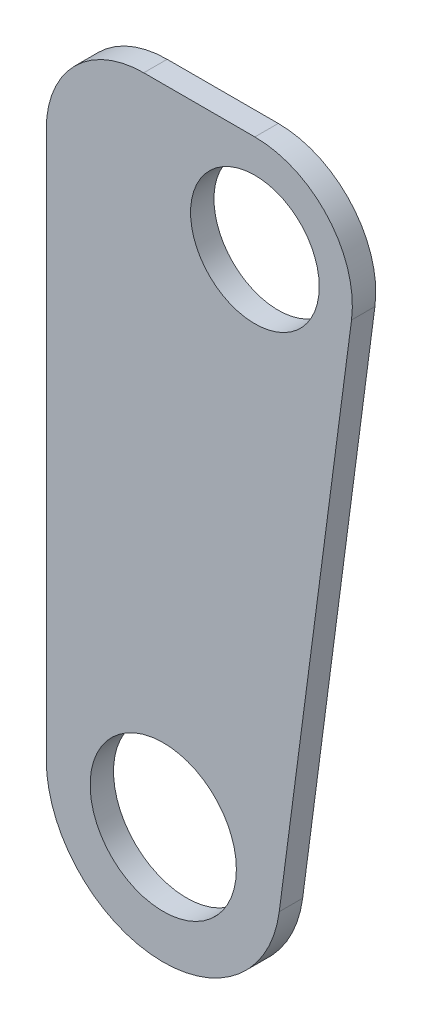
ISO-10303-21;
HEADER;
FILE_DESCRIPTION(('STEP AP214'),'2;1');
FILE_NAME('part.step','',(''),(''),'','','');
FILE_SCHEMA(('AUTOMOTIVE_DESIGN { 1 0 10303 214 1 1 1 1 }'));
ENDSEC;
DATA;
#1=APPLICATION_CONTEXT('core data for automotive mechanical design processes');
#2=APPLICATION_PROTOCOL_DEFINITION('international standard','automotive_design',2000,#1);
#3=PRODUCT_CONTEXT('',#1,'mechanical');
#4=PRODUCT('Part','Part','',(#3));
#5=PRODUCT_RELATED_PRODUCT_CATEGORY('part','',(#4));
#6=PRODUCT_DEFINITION_FORMATION('','',#4);
#7=PRODUCT_DEFINITION_CONTEXT('part definition',#1,'design');
#8=PRODUCT_DEFINITION('design','',#6,#7);
#9=PRODUCT_DEFINITION_SHAPE('','',#8);
#10=(LENGTH_UNIT() NAMED_UNIT(*) SI_UNIT(.MILLI.,.METRE.));
#11=(NAMED_UNIT(*) PLANE_ANGLE_UNIT() SI_UNIT($,.RADIAN.));
#12=(NAMED_UNIT(*) SI_UNIT($,.STERADIAN.) SOLID_ANGLE_UNIT());
#13=UNCERTAINTY_MEASURE_WITH_UNIT(LENGTH_MEASURE(1.E-05),#10,'distance_accuracy_value','');
#14=(GEOMETRIC_REPRESENTATION_CONTEXT(3) GLOBAL_UNCERTAINTY_ASSIGNED_CONTEXT((#13)) GLOBAL_UNIT_ASSIGNED_CONTEXT((#10,
#11,#12)) REPRESENTATION_CONTEXT('',''));
#15=CARTESIAN_POINT('',(0.,0.,0.));
#16=DIRECTION('',(0.,0.,1.));
#17=DIRECTION('',(1.,0.,0.));
#18=AXIS2_PLACEMENT_3D('',#15,#16,#17);
#19=CARTESIAN_POINT('',(0.,0.,12.));
#20=DIRECTION('',(0.,0.,1.));
#21=DIRECTION('',(1.,0.,0.));
#22=AXIS2_PLACEMENT_3D('',#19,#20,#21);
#23=PLANE('',#22);
#24=CARTESIAN_POINT('',(0.,0.,12.));
#25=DIRECTION('',(0.,0.,1.));
#26=DIRECTION('',(1.,0.,0.));
#27=AXIS2_PLACEMENT_3D('',#24,#25,#26);
#28=CIRCLE('',#27,37.5);
#29=CARTESIAN_POINT('',(37.5,0.,12.));
#30=VERTEX_POINT('',#29);
#31=EDGE_CURVE('E145',#30,#30,#28,.T.);
#32=ORIENTED_EDGE('',*,*,#31,.F.);
#33=EDGE_LOOP('',(#32));
#34=FACE_BOUND('',#33,.T.);
#35=DIRECTION('',(-1.,0.,0.));
#36=VECTOR('',#35,1.);
#37=CARTESIAN_POINT('',(-60.,330.,12.));
#38=LINE('',#37,#36);
#39=CARTESIAN_POINT('',(46.9797463294878,330.,12.));
#40=VERTEX_POINT('',#39);
#41=CARTESIAN_POINT('',(-9.99999999999999,330.,12.));
#42=VERTEX_POINT('',#41);
#43=EDGE_CURVE('E94',#40,#42,#38,.T.);
#44=ORIENTED_EDGE('',*,*,#43,.T.);
#45=CARTESIAN_POINT('',(-9.99999999999999,280.,12.));
#46=DIRECTION('',(0.,0.,1.));
#47=DIRECTION('',(1.,0.,0.));
#48=AXIS2_PLACEMENT_3D('',#45,#46,#47);
#49=CIRCLE('',#48,50.);
#50=CARTESIAN_POINT('',(-60.,280.,12.));
#51=VERTEX_POINT('',#50);
#52=EDGE_CURVE('E42',#42,#51,#49,.T.);
#53=ORIENTED_EDGE('',*,*,#52,.T.);
#54=DIRECTION('',(0.,-1.,0.));
#55=VECTOR('',#54,1.);
#56=CARTESIAN_POINT('',(-60.,0.,12.));
#57=LINE('',#56,#55);
#58=CARTESIAN_POINT('',(-60.,0.,12.));
#59=VERTEX_POINT('',#58);
#60=EDGE_CURVE('E100',#51,#59,#57,.T.);
#61=ORIENTED_EDGE('',*,*,#60,.T.);
#62=CARTESIAN_POINT('',(0.,0.,12.));
#63=DIRECTION('',(0.,0.,1.));
#64=DIRECTION('',(1.,0.,0.));
#65=AXIS2_PLACEMENT_3D('',#62,#63,#64);
#66=CIRCLE('',#65,60.);
#67=CARTESIAN_POINT('',(59.4858496514576,-7.83796473864118,12.));
#68=VERTEX_POINT('',#67);
#69=EDGE_CURVE('E95',#59,#68,#66,.T.);
#70=ORIENTED_EDGE('',*,*,#69,.T.);
#71=DIRECTION('',(0.13063274564402,0.991430827524293,0.));
#72=VECTOR('',#71,1.);
#73=CARTESIAN_POINT('',(104.,330.,12.));
#74=LINE('',#73,#72);
#75=CARTESIAN_POINT('',(96.5512877057025,273.468362717799,12.));
#76=VERTEX_POINT('',#75);
#77=EDGE_CURVE('E86',#68,#76,#74,.T.);
#78=ORIENTED_EDGE('',*,*,#77,.T.);
#79=CARTESIAN_POINT('',(46.9797463294878,280.,12.));
#80=DIRECTION('',(0.,0.,1.));
#81=DIRECTION('',(1.,0.,0.));
#82=AXIS2_PLACEMENT_3D('',#79,#80,#81);
#83=CIRCLE('',#82,50.);
#84=EDGE_CURVE('E125',#76,#40,#83,.T.);
#85=ORIENTED_EDGE('',*,*,#84,.T.);
#86=EDGE_LOOP('',(#44,#53,#61,#70,#78,#85));
#87=FACE_BOUND('',#86,.T.);
#88=CARTESIAN_POINT('',(47.,280.,12.));
#89=DIRECTION('',(0.,0.,1.));
#90=DIRECTION('',(1.,0.,0.));
#91=AXIS2_PLACEMENT_3D('',#88,#89,#90);
#92=CIRCLE('',#91,33.);
#93=CARTESIAN_POINT('',(80.,280.,12.));
#94=VERTEX_POINT('',#93);
#95=EDGE_CURVE('E151',#94,#94,#92,.T.);
#96=ORIENTED_EDGE('',*,*,#95,.F.);
#97=EDGE_LOOP('',(#96));
#98=FACE_BOUND('',#97,.T.);
#99=ADVANCED_FACE('F34',(#34,#87,#98),#23,.T.);
#100=CARTESIAN_POINT('',(0.,0.,0.));
#101=DIRECTION('',(0.,0.,1.));
#102=DIRECTION('',(1.,0.,0.));
#103=AXIS2_PLACEMENT_3D('',#100,#101,#102);
#104=PLANE('',#103);
#105=DIRECTION('',(0.,-1.,0.));
#106=VECTOR('',#105,1.);
#107=CARTESIAN_POINT('',(-60.,0.,0.));
#108=LINE('',#107,#106);
#109=CARTESIAN_POINT('',(-60.,280.,0.));
#110=VERTEX_POINT('',#109);
#111=CARTESIAN_POINT('',(-60.,0.,0.));
#112=VERTEX_POINT('',#111);
#113=EDGE_CURVE('E104',#110,#112,#108,.T.);
#114=ORIENTED_EDGE('',*,*,#113,.F.);
#115=CARTESIAN_POINT('',(-9.99999999999999,280.,0.));
#116=DIRECTION('',(0.,0.,1.));
#117=DIRECTION('',(1.,0.,0.));
#118=AXIS2_PLACEMENT_3D('',#115,#116,#117);
#119=CIRCLE('',#118,50.);
#120=CARTESIAN_POINT('',(-9.99999999999999,330.,0.));
#121=VERTEX_POINT('',#120);
#122=EDGE_CURVE('E119',#110,#121,#119,.F.);
#123=ORIENTED_EDGE('',*,*,#122,.T.);
#124=DIRECTION('',(-1.,0.,0.));
#125=VECTOR('',#124,1.);
#126=CARTESIAN_POINT('',(-60.,330.,0.));
#127=LINE('',#126,#125);
#128=CARTESIAN_POINT('',(46.9797463294878,330.,0.));
#129=VERTEX_POINT('',#128);
#130=EDGE_CURVE('E138',#129,#121,#127,.T.);
#131=ORIENTED_EDGE('',*,*,#130,.F.);
#132=CARTESIAN_POINT('',(46.9797463294878,280.,0.));
#133=DIRECTION('',(0.,0.,1.));
#134=DIRECTION('',(1.,0.,0.));
#135=AXIS2_PLACEMENT_3D('',#132,#133,#134);
#136=CIRCLE('',#135,50.);
#137=CARTESIAN_POINT('',(96.5512877057025,273.468362717799,0.));
#138=VERTEX_POINT('',#137);
#139=EDGE_CURVE('E113',#129,#138,#136,.F.);
#140=ORIENTED_EDGE('',*,*,#139,.T.);
#141=DIRECTION('',(0.13063274564402,0.991430827524293,0.));
#142=VECTOR('',#141,1.);
#143=CARTESIAN_POINT('',(104.,330.,0.));
#144=LINE('',#143,#142);
#145=CARTESIAN_POINT('',(59.4858496514576,-7.83796473864118,0.));
#146=VERTEX_POINT('',#145);
#147=EDGE_CURVE('E141',#146,#138,#144,.T.);
#148=ORIENTED_EDGE('',*,*,#147,.F.);
#149=CARTESIAN_POINT('',(0.,0.,0.));
#150=DIRECTION('',(0.,0.,1.));
#151=DIRECTION('',(1.,0.,0.));
#152=AXIS2_PLACEMENT_3D('',#149,#150,#151);
#153=CIRCLE('',#152,60.);
#154=EDGE_CURVE('E108',#112,#146,#153,.T.);
#155=ORIENTED_EDGE('',*,*,#154,.F.);
#156=EDGE_LOOP('',(#114,#123,#131,#140,#148,#155));
#157=FACE_BOUND('',#156,.T.);
#158=CARTESIAN_POINT('',(0.,0.,0.));
#159=DIRECTION('',(0.,0.,1.));
#160=DIRECTION('',(1.,0.,0.));
#161=AXIS2_PLACEMENT_3D('',#158,#159,#160);
#162=CIRCLE('',#161,37.5);
#163=CARTESIAN_POINT('',(37.5,0.,0.));
#164=VERTEX_POINT('',#163);
#165=EDGE_CURVE('E148',#164,#164,#162,.T.);
#166=ORIENTED_EDGE('',*,*,#165,.T.);
#167=EDGE_LOOP('',(#166));
#168=FACE_BOUND('',#167,.T.);
#169=CARTESIAN_POINT('',(47.,280.,0.));
#170=DIRECTION('',(0.,0.,1.));
#171=DIRECTION('',(1.,0.,0.));
#172=AXIS2_PLACEMENT_3D('',#169,#170,#171);
#173=CIRCLE('',#172,33.);
#174=CARTESIAN_POINT('',(80.,280.,0.));
#175=VERTEX_POINT('',#174);
#176=EDGE_CURVE('E154',#175,#175,#173,.T.);
#177=ORIENTED_EDGE('',*,*,#176,.T.);
#178=EDGE_LOOP('',(#177));
#179=FACE_BOUND('',#178,.T.);
#180=ADVANCED_FACE('F136',(#157,#168,#179),#104,.F.);
#181=CARTESIAN_POINT('',(0.,0.,12.));
#182=DIRECTION('',(0.,0.,-1.));
#183=DIRECTION('',(-1.,0.,0.));
#184=AXIS2_PLACEMENT_3D('',#181,#182,#183);
#185=CYLINDRICAL_SURFACE('',#184,60.);
#186=ORIENTED_EDGE('',*,*,#154,.T.);
#187=DIRECTION('',(0.,0.,-1.));
#188=VECTOR('',#187,1.);
#189=CARTESIAN_POINT('',(59.4858496514576,-7.83796473864118,12.));
#190=LINE('',#189,#188);
#191=EDGE_CURVE('E90',#68,#146,#190,.T.);
#192=ORIENTED_EDGE('',*,*,#191,.F.);
#193=ORIENTED_EDGE('',*,*,#69,.F.);
#194=DIRECTION('',(0.,0.,-1.));
#195=VECTOR('',#194,1.);
#196=CARTESIAN_POINT('',(-60.,0.,12.));
#197=LINE('',#196,#195);
#198=EDGE_CURVE('E110',#59,#112,#197,.T.);
#199=ORIENTED_EDGE('',*,*,#198,.T.);
#200=EDGE_LOOP('',(#186,#192,#193,#199));
#201=FACE_BOUND('',#200,.T.);
#202=ADVANCED_FACE('F106',(#201),#185,.T.);
#203=CARTESIAN_POINT('',(104.,330.,12.));
#204=DIRECTION('',(-0.991430827524293,0.13063274564402,0.));
#205=DIRECTION('',(-0.13063274564402,-0.991430827524293,0.));
#206=AXIS2_PLACEMENT_3D('',#203,#204,#205);
#207=PLANE('',#206);
#208=ORIENTED_EDGE('',*,*,#147,.T.);
#209=DIRECTION('',(0.,0.,-1.));
#210=VECTOR('',#209,1.);
#211=CARTESIAN_POINT('',(96.5512877057025,273.468362717799,12.));
#212=LINE('',#211,#210);
#213=EDGE_CURVE('E11',#138,#76,#212,.F.);
#214=ORIENTED_EDGE('',*,*,#213,.T.);
#215=ORIENTED_EDGE('',*,*,#77,.F.);
#216=ORIENTED_EDGE('',*,*,#191,.T.);
#217=EDGE_LOOP('',(#208,#214,#215,#216));
#218=FACE_BOUND('',#217,.T.);
#219=ADVANCED_FACE('F88',(#218),#207,.F.);
#220=CARTESIAN_POINT('',(-60.,330.,12.));
#221=DIRECTION('',(0.,-1.,0.));
#222=DIRECTION('',(0.,0.,-1.));
#223=AXIS2_PLACEMENT_3D('',#220,#221,#222);
#224=PLANE('',#223);
#225=ORIENTED_EDGE('',*,*,#130,.T.);
#226=DIRECTION('',(0.,0.,-1.));
#227=VECTOR('',#226,1.);
#228=CARTESIAN_POINT('',(-9.99999999999999,330.,12.));
#229=LINE('',#228,#227);
#230=EDGE_CURVE('E55',#121,#42,#229,.F.);
#231=ORIENTED_EDGE('',*,*,#230,.T.);
#232=ORIENTED_EDGE('',*,*,#43,.F.);
#233=DIRECTION('',(0.,0.,-1.));
#234=VECTOR('',#233,1.);
#235=CARTESIAN_POINT('',(46.9797463294878,330.,12.));
#236=LINE('',#235,#234);
#237=EDGE_CURVE('E121',#40,#129,#236,.T.);
#238=ORIENTED_EDGE('',*,*,#237,.T.);
#239=EDGE_LOOP('',(#225,#231,#232,#238));
#240=FACE_BOUND('',#239,.T.);
#241=ADVANCED_FACE('F139',(#240),#224,.F.);
#242=CARTESIAN_POINT('',(-60.,0.,12.));
#243=DIRECTION('',(1.,0.,0.));
#244=DIRECTION('',(0.,0.,-1.));
#245=AXIS2_PLACEMENT_3D('',#242,#243,#244);
#246=PLANE('',#245);
#247=ORIENTED_EDGE('',*,*,#60,.F.);
#248=DIRECTION('',(0.,0.,-1.));
#249=VECTOR('',#248,1.);
#250=CARTESIAN_POINT('',(-60.,280.,12.));
#251=LINE('',#250,#249);
#252=EDGE_CURVE('E109',#51,#110,#251,.T.);
#253=ORIENTED_EDGE('',*,*,#252,.T.);
#254=ORIENTED_EDGE('',*,*,#113,.T.);
#255=ORIENTED_EDGE('',*,*,#198,.F.);
#256=EDGE_LOOP('',(#247,#253,#254,#255));
#257=FACE_BOUND('',#256,.T.);
#258=ADVANCED_FACE('F130',(#257),#246,.F.);
#259=CARTESIAN_POINT('',(0.,0.,12.));
#260=DIRECTION('',(0.,0.,-1.));
#261=DIRECTION('',(-1.,0.,0.));
#262=AXIS2_PLACEMENT_3D('',#259,#260,#261);
#263=CYLINDRICAL_SURFACE('',#262,37.5);
#264=ORIENTED_EDGE('',*,*,#31,.T.);
#265=EDGE_LOOP('',(#264));
#266=FACE_BOUND('',#265,.T.);
#267=ORIENTED_EDGE('',*,*,#165,.F.);
#268=EDGE_LOOP('',(#267));
#269=FACE_BOUND('',#268,.T.);
#270=ADVANCED_FACE('F171',(#266,#269),#263,.F.);
#271=CARTESIAN_POINT('',(47.,280.,12.));
#272=DIRECTION('',(0.,0.,-1.));
#273=DIRECTION('',(-1.,0.,0.));
#274=AXIS2_PLACEMENT_3D('',#271,#272,#273);
#275=CYLINDRICAL_SURFACE('',#274,33.);
#276=ORIENTED_EDGE('',*,*,#95,.T.);
#277=EDGE_LOOP('',(#276));
#278=FACE_BOUND('',#277,.T.);
#279=ORIENTED_EDGE('',*,*,#176,.F.);
#280=EDGE_LOOP('',(#279));
#281=FACE_BOUND('',#280,.T.);
#282=ADVANCED_FACE('F160',(#278,#281),#275,.F.);
#283=CARTESIAN_POINT('',(-9.99999999999999,280.,12.));
#284=DIRECTION('',(0.,0.,-1.));
#285=DIRECTION('',(-1.,0.,0.));
#286=AXIS2_PLACEMENT_3D('',#283,#284,#285);
#287=CYLINDRICAL_SURFACE('',#286,50.);
#288=ORIENTED_EDGE('',*,*,#52,.F.);
#289=ORIENTED_EDGE('',*,*,#230,.F.);
#290=ORIENTED_EDGE('',*,*,#122,.F.);
#291=ORIENTED_EDGE('',*,*,#252,.F.);
#292=EDGE_LOOP('',(#288,#289,#290,#291));
#293=FACE_BOUND('',#292,.T.);
#294=ADVANCED_FACE('F133',(#293),#287,.T.);
#295=CARTESIAN_POINT('',(46.9797463294878,280.,12.));
#296=DIRECTION('',(0.,0.,-1.));
#297=DIRECTION('',(-1.,0.,0.));
#298=AXIS2_PLACEMENT_3D('',#295,#296,#297);
#299=CYLINDRICAL_SURFACE('',#298,50.);
#300=ORIENTED_EDGE('',*,*,#84,.F.);
#301=ORIENTED_EDGE('',*,*,#213,.F.);
#302=ORIENTED_EDGE('',*,*,#139,.F.);
#303=ORIENTED_EDGE('',*,*,#237,.F.);
#304=EDGE_LOOP('',(#300,#301,#302,#303));
#305=FACE_BOUND('',#304,.T.);
#306=ADVANCED_FACE('F36',(#305),#299,.T.);
#307=CLOSED_SHELL('',(#99,#180,#202,#219,#241,#258,#270,#282,#294,#306));
#308=MANIFOLD_SOLID_BREP('B2',#307);
#309=ADVANCED_BREP_SHAPE_REPRESENTATION('',(#18,#308),#14);
#310=SHAPE_DEFINITION_REPRESENTATION(#9,#309);
ENDSEC;
END-ISO-10303-21;
